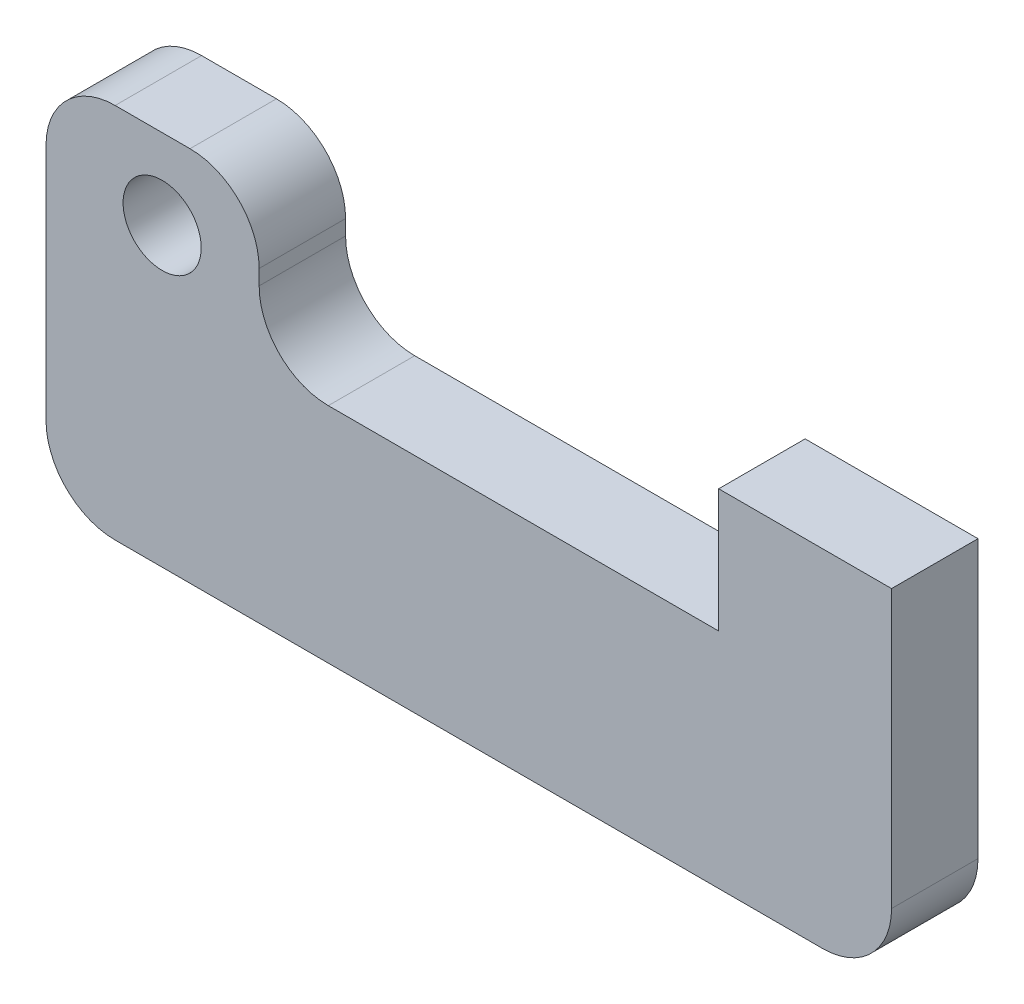
ISO-10303-21;
HEADER;
FILE_DESCRIPTION(('STEP AP214'),'2;1');
FILE_NAME('part.step','',(''),(''),'','','');
FILE_SCHEMA(('AUTOMOTIVE_DESIGN { 1 0 10303 214 1 1 1 1 }'));
ENDSEC;
DATA;
#1=APPLICATION_CONTEXT('core data for automotive mechanical design processes');
#2=APPLICATION_PROTOCOL_DEFINITION('international standard','automotive_design',2000,#1);
#3=PRODUCT_CONTEXT('',#1,'mechanical');
#4=PRODUCT('Part','Part','',(#3));
#5=PRODUCT_RELATED_PRODUCT_CATEGORY('part','',(#4));
#6=PRODUCT_DEFINITION_FORMATION('','',#4);
#7=PRODUCT_DEFINITION_CONTEXT('part definition',#1,'design');
#8=PRODUCT_DEFINITION('design','',#6,#7);
#9=PRODUCT_DEFINITION_SHAPE('','',#8);
#10=(LENGTH_UNIT() NAMED_UNIT(*) SI_UNIT(.MILLI.,.METRE.));
#11=(NAMED_UNIT(*) PLANE_ANGLE_UNIT() SI_UNIT($,.RADIAN.));
#12=(NAMED_UNIT(*) SI_UNIT($,.STERADIAN.) SOLID_ANGLE_UNIT());
#13=UNCERTAINTY_MEASURE_WITH_UNIT(LENGTH_MEASURE(1.E-05),#10,'distance_accuracy_value','');
#14=(GEOMETRIC_REPRESENTATION_CONTEXT(3) GLOBAL_UNCERTAINTY_ASSIGNED_CONTEXT((#13)) GLOBAL_UNIT_ASSIGNED_CONTEXT((#10,
#11,#12)) REPRESENTATION_CONTEXT('',''));
#15=CARTESIAN_POINT('',(0.,0.,0.));
#16=DIRECTION('',(0.,0.,1.));
#17=DIRECTION('',(1.,0.,0.));
#18=AXIS2_PLACEMENT_3D('',#15,#16,#17);
#19=CARTESIAN_POINT('',(0.,0.,6.35));
#20=DIRECTION('',(0.,0.,-1.));
#21=DIRECTION('',(-1.,0.,0.));
#22=AXIS2_PLACEMENT_3D('',#19,#20,#21);
#23=PLANE('',#22);
#24=DIRECTION('',(1.,0.,0.));
#25=VECTOR('',#24,1.);
#26=CARTESIAN_POINT('',(-146.05,-25.4365262296895,6.35));
#27=LINE('',#26,#25);
#28=CARTESIAN_POINT('',(-190.392684717086,-25.4365262296895,6.35));
#29=VERTEX_POINT('',#28);
#30=CARTESIAN_POINT('',(-138.43,-25.4365262296895,6.35));
#31=VERTEX_POINT('',#30);
#32=EDGE_CURVE('E233',#29,#31,#27,.T.);
#33=ORIENTED_EDGE('',*,*,#32,.T.);
#34=CARTESIAN_POINT('',(-138.43,-20.3565262296895,6.35));
#35=DIRECTION('',(0.,0.,-1.));
#36=DIRECTION('',(-1.,0.,0.));
#37=AXIS2_PLACEMENT_3D('',#34,#35,#36);
#38=CIRCLE('',#37,5.08);
#39=CARTESIAN_POINT('',(-133.35,-20.3565262296895,6.35));
#40=VERTEX_POINT('',#39);
#41=EDGE_CURVE('E134',#31,#40,#38,.F.);
#42=ORIENTED_EDGE('',*,*,#41,.T.);
#43=DIRECTION('',(0.,1.,0.));
#44=VECTOR('',#43,1.);
#45=CARTESIAN_POINT('',(-133.35,0.,6.35));
#46=LINE('',#45,#44);
#47=CARTESIAN_POINT('',(-133.35,0.,6.35));
#48=VERTEX_POINT('',#47);
#49=EDGE_CURVE('E127',#40,#48,#46,.T.);
#50=ORIENTED_EDGE('',*,*,#49,.T.);
#51=DIRECTION('',(-1.,0.,0.));
#52=VECTOR('',#51,1.);
#53=CARTESIAN_POINT('',(-133.35,0.,6.35));
#54=LINE('',#53,#52);
#55=CARTESIAN_POINT('',(-146.05,0.,6.35));
#56=VERTEX_POINT('',#55);
#57=EDGE_CURVE('E131',#48,#56,#54,.T.);
#58=ORIENTED_EDGE('',*,*,#57,.T.);
#59=DIRECTION('',(0.,-1.,0.));
#60=VECTOR('',#59,1.);
#61=CARTESIAN_POINT('',(-146.05,0.,6.35));
#62=LINE('',#61,#60);
#63=CARTESIAN_POINT('',(-146.05,-9.05192086019291,6.35));
#64=VERTEX_POINT('',#63);
#65=EDGE_CURVE('E149',#56,#64,#62,.T.);
#66=ORIENTED_EDGE('',*,*,#65,.T.);
#67=DIRECTION('',(-1.,0.,0.));
#68=VECTOR('',#67,1.);
#69=CARTESIAN_POINT('',(-146.05,-9.05192086019291,6.35));
#70=LINE('',#69,#68);
#71=CARTESIAN_POINT('',(-174.732411975043,-9.05192086019291,6.35));
#72=VERTEX_POINT('',#71);
#73=EDGE_CURVE('E221',#64,#72,#70,.T.);
#74=ORIENTED_EDGE('',*,*,#73,.T.);
#75=CARTESIAN_POINT('',(-174.732411975043,-3.97192086019291,6.35));
#76=DIRECTION('',(0.,0.,-1.));
#77=DIRECTION('',(-1.,0.,0.));
#78=AXIS2_PLACEMENT_3D('',#75,#76,#77);
#79=CIRCLE('',#78,5.08);
#80=CARTESIAN_POINT('',(-179.812411975043,-3.97192086019291,6.35));
#81=VERTEX_POINT('',#80);
#82=EDGE_CURVE('E11',#72,#81,#79,.T.);
#83=ORIENTED_EDGE('',*,*,#82,.T.);
#84=DIRECTION('',(0.,1.,0.));
#85=VECTOR('',#84,1.);
#86=CARTESIAN_POINT('',(-179.812411975043,-9.05192086019291,6.35));
#87=LINE('',#86,#85);
#88=CARTESIAN_POINT('',(-179.812411975043,-2.86394856085392,6.35));
#89=VERTEX_POINT('',#88);
#90=EDGE_CURVE('E219',#81,#89,#87,.T.);
#91=ORIENTED_EDGE('',*,*,#90,.T.);
#92=CARTESIAN_POINT('',(-184.892411975043,-2.86394856085392,6.35));
#93=DIRECTION('',(0.,0.,-1.));
#94=DIRECTION('',(-1.,0.,0.));
#95=AXIS2_PLACEMENT_3D('',#92,#93,#94);
#96=CIRCLE('',#95,5.08);
#97=CARTESIAN_POINT('',(-184.892411975043,2.21605143914608,6.35));
#98=VERTEX_POINT('',#97);
#99=EDGE_CURVE('E175',#89,#98,#96,.F.);
#100=ORIENTED_EDGE('',*,*,#99,.T.);
#101=DIRECTION('',(-1.,0.,0.));
#102=VECTOR('',#101,1.);
#103=CARTESIAN_POINT('',(-195.472684717086,2.21605143914608,6.35));
#104=LINE('',#103,#102);
#105=CARTESIAN_POINT('',(-190.392684717086,2.21605143914608,6.35));
#106=VERTEX_POINT('',#105);
#107=EDGE_CURVE('E225',#98,#106,#104,.T.);
#108=ORIENTED_EDGE('',*,*,#107,.T.);
#109=CARTESIAN_POINT('',(-190.392684717086,-2.86394856085392,6.35));
#110=DIRECTION('',(0.,0.,-1.));
#111=DIRECTION('',(-1.,0.,0.));
#112=AXIS2_PLACEMENT_3D('',#109,#110,#111);
#113=CIRCLE('',#112,5.08);
#114=CARTESIAN_POINT('',(-195.472684717086,-2.86394856085392,6.35));
#115=VERTEX_POINT('',#114);
#116=EDGE_CURVE('E55',#106,#115,#113,.F.);
#117=ORIENTED_EDGE('',*,*,#116,.T.);
#118=DIRECTION('',(0.,-1.,0.));
#119=VECTOR('',#118,1.);
#120=CARTESIAN_POINT('',(-195.472684717086,-16.6784219637961,6.35));
#121=LINE('',#120,#119);
#122=CARTESIAN_POINT('',(-195.472684717086,-20.3565262296895,6.35));
#123=VERTEX_POINT('',#122);
#124=EDGE_CURVE('E227',#115,#123,#121,.T.);
#125=ORIENTED_EDGE('',*,*,#124,.T.);
#126=CARTESIAN_POINT('',(-190.392684717086,-20.3565262296895,6.35));
#127=DIRECTION('',(0.,0.,-1.));
#128=DIRECTION('',(-1.,0.,0.));
#129=AXIS2_PLACEMENT_3D('',#126,#127,#128);
#130=CIRCLE('',#129,5.08);
#131=EDGE_CURVE('E177',#123,#29,#130,.F.);
#132=ORIENTED_EDGE('',*,*,#131,.T.);
#133=EDGE_LOOP('',(#33,#42,#50,#58,#66,#74,#83,#91,#100,#108,#117,#125,#132));
#134=FACE_BOUND('',#133,.T.);
#135=CARTESIAN_POINT('',(-186.939684717086,-3.6857565893989,6.35));
#136=DIRECTION('',(0.,0.,1.));
#137=DIRECTION('',(1.,0.,0.));
#138=AXIS2_PLACEMENT_3D('',#135,#136,#137);
#139=CIRCLE('',#138,2.87019999999999);
#140=CARTESIAN_POINT('',(-184.069484717086,-3.6857565893989,6.35));
#141=VERTEX_POINT('',#140);
#142=EDGE_CURVE('E237',#141,#141,#139,.T.);
#143=ORIENTED_EDGE('',*,*,#142,.F.);
#144=EDGE_LOOP('',(#143));
#145=FACE_BOUND('',#144,.T.);
#146=ADVANCED_FACE('F33',(#134,#145),#23,.F.);
#147=CARTESIAN_POINT('',(0.,0.,0.));
#148=DIRECTION('',(0.,0.,-1.));
#149=DIRECTION('',(-1.,0.,0.));
#150=AXIS2_PLACEMENT_3D('',#147,#148,#149);
#151=PLANE('',#150);
#152=DIRECTION('',(0.,1.,0.));
#153=VECTOR('',#152,1.);
#154=CARTESIAN_POINT('',(-133.35,-6.35000000000001,0.));
#155=LINE('',#154,#153);
#156=CARTESIAN_POINT('',(-133.35,-20.3565262296895,0.));
#157=VERTEX_POINT('',#156);
#158=CARTESIAN_POINT('',(-133.35,0.,0.));
#159=VERTEX_POINT('',#158);
#160=EDGE_CURVE('E139',#157,#159,#155,.T.);
#161=ORIENTED_EDGE('',*,*,#160,.F.);
#162=CARTESIAN_POINT('',(-138.43,-20.3565262296895,0.));
#163=DIRECTION('',(0.,0.,-1.));
#164=DIRECTION('',(-1.,0.,0.));
#165=AXIS2_PLACEMENT_3D('',#162,#163,#164);
#166=CIRCLE('',#165,5.08);
#167=CARTESIAN_POINT('',(-138.43,-25.4365262296895,0.));
#168=VERTEX_POINT('',#167);
#169=EDGE_CURVE('E167',#157,#168,#166,.T.);
#170=ORIENTED_EDGE('',*,*,#169,.T.);
#171=DIRECTION('',(1.,0.,0.));
#172=VECTOR('',#171,1.);
#173=CARTESIAN_POINT('',(-133.35,-25.4365262296895,0.));
#174=LINE('',#173,#172);
#175=CARTESIAN_POINT('',(-190.392684717086,-25.4365262296895,0.));
#176=VERTEX_POINT('',#175);
#177=EDGE_CURVE('E245',#176,#168,#174,.T.);
#178=ORIENTED_EDGE('',*,*,#177,.F.);
#179=CARTESIAN_POINT('',(-190.392684717086,-20.3565262296895,0.));
#180=DIRECTION('',(0.,0.,-1.));
#181=DIRECTION('',(-1.,0.,0.));
#182=AXIS2_PLACEMENT_3D('',#179,#180,#181);
#183=CIRCLE('',#182,5.08);
#184=CARTESIAN_POINT('',(-195.472684717086,-20.3565262296895,0.));
#185=VERTEX_POINT('',#184);
#186=EDGE_CURVE('E165',#176,#185,#183,.T.);
#187=ORIENTED_EDGE('',*,*,#186,.T.);
#188=DIRECTION('',(0.,-1.,0.));
#189=VECTOR('',#188,1.);
#190=CARTESIAN_POINT('',(-195.472684717086,-25.4365262296895,0.));
#191=LINE('',#190,#189);
#192=CARTESIAN_POINT('',(-195.472684717086,-2.86394856085392,0.));
#193=VERTEX_POINT('',#192);
#194=EDGE_CURVE('E243',#193,#185,#191,.T.);
#195=ORIENTED_EDGE('',*,*,#194,.F.);
#196=CARTESIAN_POINT('',(-190.392684717086,-2.86394856085392,0.));
#197=DIRECTION('',(0.,0.,-1.));
#198=DIRECTION('',(-1.,0.,0.));
#199=AXIS2_PLACEMENT_3D('',#196,#197,#198);
#200=CIRCLE('',#199,5.08);
#201=CARTESIAN_POINT('',(-190.392684717086,2.21605143914608,0.));
#202=VERTEX_POINT('',#201);
#203=EDGE_CURVE('E156',#193,#202,#200,.T.);
#204=ORIENTED_EDGE('',*,*,#203,.T.);
#205=DIRECTION('',(-1.,0.,0.));
#206=VECTOR('',#205,1.);
#207=CARTESIAN_POINT('',(-195.472684717086,2.21605143914608,0.));
#208=LINE('',#207,#206);
#209=CARTESIAN_POINT('',(-184.892411975043,2.21605143914608,0.));
#210=VERTEX_POINT('',#209);
#211=EDGE_CURVE('E240',#210,#202,#208,.T.);
#212=ORIENTED_EDGE('',*,*,#211,.F.);
#213=CARTESIAN_POINT('',(-184.892411975043,-2.86394856085392,0.));
#214=DIRECTION('',(0.,0.,-1.));
#215=DIRECTION('',(-1.,0.,0.));
#216=AXIS2_PLACEMENT_3D('',#213,#214,#215);
#217=CIRCLE('',#216,5.08);
#218=CARTESIAN_POINT('',(-179.812411975043,-2.86394856085392,0.));
#219=VERTEX_POINT('',#218);
#220=EDGE_CURVE('E163',#210,#219,#217,.T.);
#221=ORIENTED_EDGE('',*,*,#220,.T.);
#222=DIRECTION('',(0.,1.,0.));
#223=VECTOR('',#222,1.);
#224=CARTESIAN_POINT('',(-179.812411975043,-9.05192086019291,0.));
#225=LINE('',#224,#223);
#226=CARTESIAN_POINT('',(-179.812411975043,-3.97192086019291,0.));
#227=VERTEX_POINT('',#226);
#228=EDGE_CURVE('E203',#227,#219,#225,.T.);
#229=ORIENTED_EDGE('',*,*,#228,.F.);
#230=CARTESIAN_POINT('',(-174.732411975043,-3.97192086019291,0.));
#231=DIRECTION('',(0.,0.,-1.));
#232=DIRECTION('',(-1.,0.,0.));
#233=AXIS2_PLACEMENT_3D('',#230,#231,#232);
#234=CIRCLE('',#233,5.08);
#235=CARTESIAN_POINT('',(-174.732411975043,-9.05192086019291,0.));
#236=VERTEX_POINT('',#235);
#237=EDGE_CURVE('E41',#227,#236,#234,.F.);
#238=ORIENTED_EDGE('',*,*,#237,.T.);
#239=DIRECTION('',(-1.,0.,0.));
#240=VECTOR('',#239,1.);
#241=CARTESIAN_POINT('',(-146.05,-9.05192086019291,0.));
#242=LINE('',#241,#240);
#243=CARTESIAN_POINT('',(-146.05,-9.05192086019291,0.));
#244=VERTEX_POINT('',#243);
#245=EDGE_CURVE('E201',#244,#236,#242,.T.);
#246=ORIENTED_EDGE('',*,*,#245,.F.);
#247=DIRECTION('',(0.,-1.,0.));
#248=VECTOR('',#247,1.);
#249=CARTESIAN_POINT('',(-146.05,-6.35000000000001,0.));
#250=LINE('',#249,#248);
#251=CARTESIAN_POINT('',(-146.05,0.,0.));
#252=VERTEX_POINT('',#251);
#253=EDGE_CURVE('E213',#252,#244,#250,.T.);
#254=ORIENTED_EDGE('',*,*,#253,.F.);
#255=DIRECTION('',(-1.,0.,0.));
#256=VECTOR('',#255,1.);
#257=CARTESIAN_POINT('',(-133.35,0.,0.));
#258=LINE('',#257,#256);
#259=EDGE_CURVE('E235',#159,#252,#258,.T.);
#260=ORIENTED_EDGE('',*,*,#259,.F.);
#261=EDGE_LOOP('',(#161,#170,#178,#187,#195,#204,#212,#221,#229,#238,#246,#254,#260));
#262=FACE_BOUND('',#261,.T.);
#263=CARTESIAN_POINT('',(-186.939684717086,-3.6857565893989,0.));
#264=DIRECTION('',(0.,0.,1.));
#265=DIRECTION('',(1.,0.,0.));
#266=AXIS2_PLACEMENT_3D('',#263,#264,#265);
#267=CIRCLE('',#266,2.87019999999999);
#268=CARTESIAN_POINT('',(-184.069484717086,-3.6857565893989,0.));
#269=VERTEX_POINT('',#268);
#270=EDGE_CURVE('E259',#269,#269,#267,.T.);
#271=ORIENTED_EDGE('',*,*,#270,.T.);
#272=EDGE_LOOP('',(#271));
#273=FACE_BOUND('',#272,.T.);
#274=ADVANCED_FACE('F199',(#262,#273),#151,.T.);
#275=CARTESIAN_POINT('',(-133.35,0.,6.35));
#276=DIRECTION('',(0.,-1.,0.));
#277=DIRECTION('',(0.,0.,-1.));
#278=AXIS2_PLACEMENT_3D('',#275,#276,#277);
#279=PLANE('',#278);
#280=ORIENTED_EDGE('',*,*,#259,.T.);
#281=DIRECTION('',(0.,0.,-1.));
#282=VECTOR('',#281,1.);
#283=CARTESIAN_POINT('',(-146.05,0.,6.35));
#284=LINE('',#283,#282);
#285=EDGE_CURVE('E147',#56,#252,#284,.T.);
#286=ORIENTED_EDGE('',*,*,#285,.F.);
#287=ORIENTED_EDGE('',*,*,#57,.F.);
#288=DIRECTION('',(0.,0.,-1.));
#289=VECTOR('',#288,1.);
#290=CARTESIAN_POINT('',(-133.35,0.,6.35));
#291=LINE('',#290,#289);
#292=EDGE_CURVE('E145',#48,#159,#291,.T.);
#293=ORIENTED_EDGE('',*,*,#292,.T.);
#294=EDGE_LOOP('',(#280,#286,#287,#293));
#295=FACE_BOUND('',#294,.T.);
#296=ADVANCED_FACE('F144',(#295),#279,.F.);
#297=CARTESIAN_POINT('',(-146.05,-6.35000000000001,6.35));
#298=DIRECTION('',(1.,0.,0.));
#299=DIRECTION('',(0.,0.,-1.));
#300=AXIS2_PLACEMENT_3D('',#297,#298,#299);
#301=PLANE('',#300);
#302=ORIENTED_EDGE('',*,*,#253,.T.);
#303=DIRECTION('',(0.,0.,-1.));
#304=VECTOR('',#303,1.);
#305=CARTESIAN_POINT('',(-146.05,-9.05192086019291,6.35));
#306=LINE('',#305,#304);
#307=EDGE_CURVE('E158',#64,#244,#306,.T.);
#308=ORIENTED_EDGE('',*,*,#307,.F.);
#309=ORIENTED_EDGE('',*,*,#65,.F.);
#310=ORIENTED_EDGE('',*,*,#285,.T.);
#311=EDGE_LOOP('',(#302,#308,#309,#310));
#312=FACE_BOUND('',#311,.T.);
#313=ADVANCED_FACE('F257',(#312),#301,.F.);
#314=CARTESIAN_POINT('',(-146.05,-9.05192086019291,6.35));
#315=DIRECTION('',(0.,-1.,0.));
#316=DIRECTION('',(1.,0.,0.));
#317=AXIS2_PLACEMENT_3D('',#314,#315,#316);
#318=PLANE('',#317);
#319=ORIENTED_EDGE('',*,*,#245,.T.);
#320=DIRECTION('',(0.,0.,-1.));
#321=VECTOR('',#320,1.);
#322=CARTESIAN_POINT('',(-174.732411975043,-9.05192086019291,6.35));
#323=LINE('',#322,#321);
#324=EDGE_CURVE('E189',#236,#72,#323,.F.);
#325=ORIENTED_EDGE('',*,*,#324,.T.);
#326=ORIENTED_EDGE('',*,*,#73,.F.);
#327=ORIENTED_EDGE('',*,*,#307,.T.);
#328=EDGE_LOOP('',(#319,#325,#326,#327));
#329=FACE_BOUND('',#328,.T.);
#330=ADVANCED_FACE('F209',(#329),#318,.F.);
#331=CARTESIAN_POINT('',(-179.812411975043,-9.05192086019291,6.35));
#332=DIRECTION('',(-1.,0.,0.));
#333=DIRECTION('',(0.,0.,1.));
#334=AXIS2_PLACEMENT_3D('',#331,#332,#333);
#335=PLANE('',#334);
#336=ORIENTED_EDGE('',*,*,#90,.F.);
#337=DIRECTION('',(0.,0.,-1.));
#338=VECTOR('',#337,1.);
#339=CARTESIAN_POINT('',(-179.812411975043,-3.97192086019291,0.));
#340=LINE('',#339,#338);
#341=EDGE_CURVE('E186',#81,#227,#340,.T.);
#342=ORIENTED_EDGE('',*,*,#341,.T.);
#343=ORIENTED_EDGE('',*,*,#228,.T.);
#344=DIRECTION('',(0.,0.,-1.));
#345=VECTOR('',#344,1.);
#346=CARTESIAN_POINT('',(-179.812411975043,-2.86394856085392,6.35));
#347=LINE('',#346,#345);
#348=EDGE_CURVE('E184',#219,#89,#347,.F.);
#349=ORIENTED_EDGE('',*,*,#348,.T.);
#350=EDGE_LOOP('',(#336,#342,#343,#349));
#351=FACE_BOUND('',#350,.T.);
#352=ADVANCED_FACE('F223',(#351),#335,.F.);
#353=CARTESIAN_POINT('',(-195.472684717086,2.21605143914608,6.35));
#354=DIRECTION('',(0.,-1.,0.));
#355=DIRECTION('',(0.,0.,-1.));
#356=AXIS2_PLACEMENT_3D('',#353,#354,#355);
#357=PLANE('',#356);
#358=ORIENTED_EDGE('',*,*,#107,.F.);
#359=DIRECTION('',(0.,0.,-1.));
#360=VECTOR('',#359,1.);
#361=CARTESIAN_POINT('',(-184.892411975043,2.21605143914608,6.35));
#362=LINE('',#361,#360);
#363=EDGE_CURVE('E193',#98,#210,#362,.T.);
#364=ORIENTED_EDGE('',*,*,#363,.T.);
#365=ORIENTED_EDGE('',*,*,#211,.T.);
#366=DIRECTION('',(0.,0.,-1.));
#367=VECTOR('',#366,1.);
#368=CARTESIAN_POINT('',(-190.392684717086,2.21605143914608,6.35));
#369=LINE('',#368,#367);
#370=EDGE_CURVE('E191',#202,#106,#369,.F.);
#371=ORIENTED_EDGE('',*,*,#370,.T.);
#372=EDGE_LOOP('',(#358,#364,#365,#371));
#373=FACE_BOUND('',#372,.T.);
#374=ADVANCED_FACE('F282',(#373),#357,.F.);
#375=CARTESIAN_POINT('',(-195.472684717086,-25.4365262296895,6.35));
#376=DIRECTION('',(1.,0.,0.));
#377=DIRECTION('',(0.,0.,-1.));
#378=AXIS2_PLACEMENT_3D('',#375,#376,#377);
#379=PLANE('',#378);
#380=ORIENTED_EDGE('',*,*,#194,.T.);
#381=DIRECTION('',(0.,0.,-1.));
#382=VECTOR('',#381,1.);
#383=CARTESIAN_POINT('',(-195.472684717086,-20.3565262296895,6.35));
#384=LINE('',#383,#382);
#385=EDGE_CURVE('E48',#185,#123,#384,.F.);
#386=ORIENTED_EDGE('',*,*,#385,.T.);
#387=ORIENTED_EDGE('',*,*,#124,.F.);
#388=DIRECTION('',(0.,0.,-1.));
#389=VECTOR('',#388,1.);
#390=CARTESIAN_POINT('',(-195.472684717086,-2.86394856085392,6.35));
#391=LINE('',#390,#389);
#392=EDGE_CURVE('E180',#115,#193,#391,.T.);
#393=ORIENTED_EDGE('',*,*,#392,.T.);
#394=EDGE_LOOP('',(#380,#386,#387,#393));
#395=FACE_BOUND('',#394,.T.);
#396=ADVANCED_FACE('F279',(#395),#379,.F.);
#397=CARTESIAN_POINT('',(-133.35,-25.4365262296895,6.35));
#398=DIRECTION('',(0.,1.,0.));
#399=DIRECTION('',(0.,0.,1.));
#400=AXIS2_PLACEMENT_3D('',#397,#398,#399);
#401=PLANE('',#400);
#402=ORIENTED_EDGE('',*,*,#177,.T.);
#403=DIRECTION('',(0.,0.,-1.));
#404=VECTOR('',#403,1.);
#405=CARTESIAN_POINT('',(-138.43,-25.4365262296895,6.35));
#406=LINE('',#405,#404);
#407=EDGE_CURVE('E172',#168,#31,#406,.F.);
#408=ORIENTED_EDGE('',*,*,#407,.T.);
#409=ORIENTED_EDGE('',*,*,#32,.F.);
#410=DIRECTION('',(0.,0.,-1.));
#411=VECTOR('',#410,1.);
#412=CARTESIAN_POINT('',(-190.392684717086,-25.4365262296895,6.35));
#413=LINE('',#412,#411);
#414=EDGE_CURVE('E169',#29,#176,#413,.T.);
#415=ORIENTED_EDGE('',*,*,#414,.T.);
#416=EDGE_LOOP('',(#402,#408,#409,#415));
#417=FACE_BOUND('',#416,.T.);
#418=ADVANCED_FACE('F251',(#417),#401,.F.);
#419=CARTESIAN_POINT('',(-133.35,-6.35000000000001,6.35));
#420=DIRECTION('',(-1.,0.,0.));
#421=DIRECTION('',(0.,0.,1.));
#422=AXIS2_PLACEMENT_3D('',#419,#420,#421);
#423=PLANE('',#422);
#424=ORIENTED_EDGE('',*,*,#49,.F.);
#425=DIRECTION('',(0.,0.,-1.));
#426=VECTOR('',#425,1.);
#427=CARTESIAN_POINT('',(-133.35,-20.3565262296895,6.35));
#428=LINE('',#427,#426);
#429=EDGE_CURVE('E154',#40,#157,#428,.T.);
#430=ORIENTED_EDGE('',*,*,#429,.T.);
#431=ORIENTED_EDGE('',*,*,#160,.T.);
#432=ORIENTED_EDGE('',*,*,#292,.F.);
#433=EDGE_LOOP('',(#424,#430,#431,#432));
#434=FACE_BOUND('',#433,.T.);
#435=ADVANCED_FACE('F151',(#434),#423,.F.);
#436=CARTESIAN_POINT('',(-186.939684717086,-3.6857565893989,6.35));
#437=DIRECTION('',(0.,0.,-1.));
#438=DIRECTION('',(-1.,0.,0.));
#439=AXIS2_PLACEMENT_3D('',#436,#437,#438);
#440=CYLINDRICAL_SURFACE('',#439,2.87019999999999);
#441=ORIENTED_EDGE('',*,*,#142,.T.);
#442=EDGE_LOOP('',(#441));
#443=FACE_BOUND('',#442,.T.);
#444=ORIENTED_EDGE('',*,*,#270,.F.);
#445=EDGE_LOOP('',(#444));
#446=FACE_BOUND('',#445,.T.);
#447=ADVANCED_FACE('F265',(#443,#446),#440,.F.);
#448=CARTESIAN_POINT('',(-138.43,-20.3565262296895,6.35));
#449=DIRECTION('',(0.,0.,-1.));
#450=DIRECTION('',(-1.,0.,0.));
#451=AXIS2_PLACEMENT_3D('',#448,#449,#450);
#452=CYLINDRICAL_SURFACE('',#451,5.08);
#453=ORIENTED_EDGE('',*,*,#41,.F.);
#454=ORIENTED_EDGE('',*,*,#407,.F.);
#455=ORIENTED_EDGE('',*,*,#169,.F.);
#456=ORIENTED_EDGE('',*,*,#429,.F.);
#457=EDGE_LOOP('',(#453,#454,#455,#456));
#458=FACE_BOUND('',#457,.T.);
#459=ADVANCED_FACE('F255',(#458),#452,.T.);
#460=CARTESIAN_POINT('',(-190.392684717086,-20.3565262296895,6.35));
#461=DIRECTION('',(0.,0.,-1.));
#462=DIRECTION('',(-1.,0.,0.));
#463=AXIS2_PLACEMENT_3D('',#460,#461,#462);
#464=CYLINDRICAL_SURFACE('',#463,5.08);
#465=ORIENTED_EDGE('',*,*,#131,.F.);
#466=ORIENTED_EDGE('',*,*,#385,.F.);
#467=ORIENTED_EDGE('',*,*,#186,.F.);
#468=ORIENTED_EDGE('',*,*,#414,.F.);
#469=EDGE_LOOP('',(#465,#466,#467,#468));
#470=FACE_BOUND('',#469,.T.);
#471=ADVANCED_FACE('F296',(#470),#464,.T.);
#472=CARTESIAN_POINT('',(-174.732411975043,-3.97192086019291,6.35));
#473=DIRECTION('',(0.,0.,1.));
#474=DIRECTION('',(1.,0.,0.));
#475=AXIS2_PLACEMENT_3D('',#472,#473,#474);
#476=CYLINDRICAL_SURFACE('',#475,5.08);
#477=ORIENTED_EDGE('',*,*,#82,.F.);
#478=ORIENTED_EDGE('',*,*,#324,.F.);
#479=ORIENTED_EDGE('',*,*,#237,.F.);
#480=ORIENTED_EDGE('',*,*,#341,.F.);
#481=EDGE_LOOP('',(#477,#478,#479,#480));
#482=FACE_BOUND('',#481,.T.);
#483=ADVANCED_FACE('F216',(#482),#476,.F.);
#484=CARTESIAN_POINT('',(-184.892411975043,-2.86394856085392,6.35));
#485=DIRECTION('',(0.,0.,-1.));
#486=DIRECTION('',(-1.,0.,0.));
#487=AXIS2_PLACEMENT_3D('',#484,#485,#486);
#488=CYLINDRICAL_SURFACE('',#487,5.08);
#489=ORIENTED_EDGE('',*,*,#99,.F.);
#490=ORIENTED_EDGE('',*,*,#348,.F.);
#491=ORIENTED_EDGE('',*,*,#220,.F.);
#492=ORIENTED_EDGE('',*,*,#363,.F.);
#493=EDGE_LOOP('',(#489,#490,#491,#492));
#494=FACE_BOUND('',#493,.T.);
#495=ADVANCED_FACE('F301',(#494),#488,.T.);
#496=CARTESIAN_POINT('',(-190.392684717086,-2.86394856085392,6.35));
#497=DIRECTION('',(0.,0.,-1.));
#498=DIRECTION('',(-1.,0.,0.));
#499=AXIS2_PLACEMENT_3D('',#496,#497,#498);
#500=CYLINDRICAL_SURFACE('',#499,5.08);
#501=ORIENTED_EDGE('',*,*,#116,.F.);
#502=ORIENTED_EDGE('',*,*,#370,.F.);
#503=ORIENTED_EDGE('',*,*,#203,.F.);
#504=ORIENTED_EDGE('',*,*,#392,.F.);
#505=EDGE_LOOP('',(#501,#502,#503,#504));
#506=FACE_BOUND('',#505,.T.);
#507=ADVANCED_FACE('F35',(#506),#500,.T.);
#508=CLOSED_SHELL('',(#146,#274,#296,#313,#330,#352,#374,#396,#418,#435,#447,#459,#471,#483,
#495,#507));
#509=MANIFOLD_SOLID_BREP('B2',#508);
#510=ADVANCED_BREP_SHAPE_REPRESENTATION('',(#18,#509),#14);
#511=SHAPE_DEFINITION_REPRESENTATION(#9,#510);
ENDSEC;
END-ISO-10303-21;
